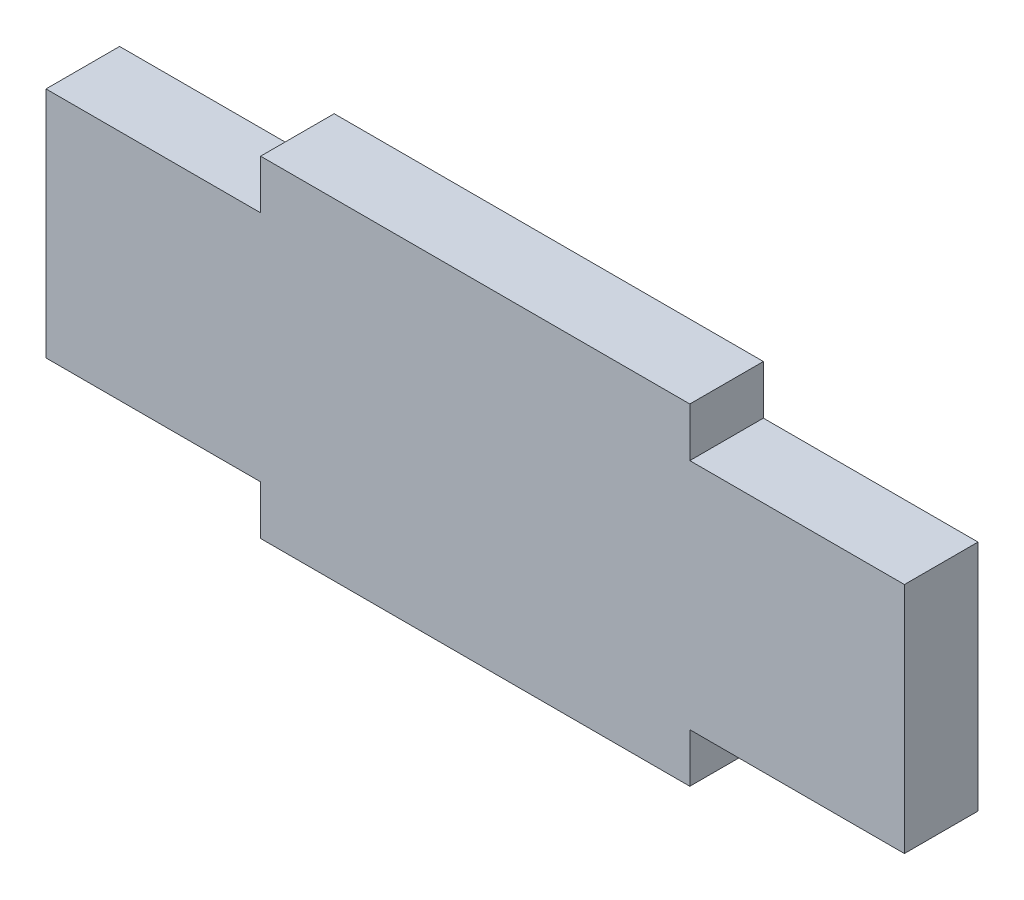
ISO-10303-21;
HEADER;
FILE_DESCRIPTION(('STEP AP214'),'2;1');
FILE_NAME('part.step','',(''),(''),'','','');
FILE_SCHEMA(('AUTOMOTIVE_DESIGN { 1 0 10303 214 1 1 1 1 }'));
ENDSEC;
DATA;
#1=APPLICATION_CONTEXT('core data for automotive mechanical design processes');
#2=APPLICATION_PROTOCOL_DEFINITION('international standard','automotive_design',2000,#1);
#3=PRODUCT_CONTEXT('',#1,'mechanical');
#4=PRODUCT('Part','Part','',(#3));
#5=PRODUCT_RELATED_PRODUCT_CATEGORY('part','',(#4));
#6=PRODUCT_DEFINITION_FORMATION('','',#4);
#7=PRODUCT_DEFINITION_CONTEXT('part definition',#1,'design');
#8=PRODUCT_DEFINITION('design','',#6,#7);
#9=PRODUCT_DEFINITION_SHAPE('','',#8);
#10=(LENGTH_UNIT() NAMED_UNIT(*) SI_UNIT(.MILLI.,.METRE.));
#11=(NAMED_UNIT(*) PLANE_ANGLE_UNIT() SI_UNIT($,.RADIAN.));
#12=(NAMED_UNIT(*) SI_UNIT($,.STERADIAN.) SOLID_ANGLE_UNIT());
#13=UNCERTAINTY_MEASURE_WITH_UNIT(LENGTH_MEASURE(1.E-05),#10,'distance_accuracy_value','');
#14=(GEOMETRIC_REPRESENTATION_CONTEXT(3) GLOBAL_UNCERTAINTY_ASSIGNED_CONTEXT((#13)) GLOBAL_UNIT_ASSIGNED_CONTEXT((#10,
#11,#12)) REPRESENTATION_CONTEXT('',''));
#15=CARTESIAN_POINT('',(0.,0.,0.));
#16=DIRECTION('',(0.,0.,1.));
#17=DIRECTION('',(1.,0.,0.));
#18=AXIS2_PLACEMENT_3D('',#15,#16,#17);
#19=CARTESIAN_POINT('',(0.,-9.5,6.));
#20=DIRECTION('',(0.,1.,0.));
#21=DIRECTION('',(-1.,0.,0.));
#22=AXIS2_PLACEMENT_3D('',#19,#20,#21);
#23=PLANE('',#22);
#24=DIRECTION('',(1.,0.,0.));
#25=VECTOR('',#24,1.);
#26=CARTESIAN_POINT('',(0.,-9.5,0.));
#27=LINE('',#26,#25);
#28=CARTESIAN_POINT('',(-35.,-9.5,0.));
#29=VERTEX_POINT('',#28);
#30=CARTESIAN_POINT('',(-17.5,-9.5,0.));
#31=VERTEX_POINT('',#30);
#32=EDGE_CURVE('E211',#29,#31,#27,.T.);
#33=ORIENTED_EDGE('',*,*,#32,.T.);
#34=DIRECTION('',(0.,0.,-1.));
#35=VECTOR('',#34,1.);
#36=CARTESIAN_POINT('',(-17.5,-9.5,6.));
#37=LINE('',#36,#35);
#38=CARTESIAN_POINT('',(-17.5,-9.5,6.));
#39=VERTEX_POINT('',#38);
#40=EDGE_CURVE('E11',#39,#31,#37,.T.);
#41=ORIENTED_EDGE('',*,*,#40,.F.);
#42=DIRECTION('',(1.,0.,0.));
#43=VECTOR('',#42,1.);
#44=CARTESIAN_POINT('',(0.,-9.5,6.));
#45=LINE('',#44,#43);
#46=CARTESIAN_POINT('',(-35.,-9.5,6.));
#47=VERTEX_POINT('',#46);
#48=EDGE_CURVE('E101',#47,#39,#45,.T.);
#49=ORIENTED_EDGE('',*,*,#48,.F.);
#50=DIRECTION('',(0.,0.,-1.));
#51=VECTOR('',#50,1.);
#52=CARTESIAN_POINT('',(-35.,-9.5,6.));
#53=LINE('',#52,#51);
#54=EDGE_CURVE('E52',#47,#29,#53,.T.);
#55=ORIENTED_EDGE('',*,*,#54,.T.);
#56=EDGE_LOOP('',(#33,#41,#49,#55));
#57=FACE_BOUND('',#56,.T.);
#58=ADVANCED_FACE('F35',(#57),#23,.F.);
#59=CARTESIAN_POINT('',(-17.5,0.,6.));
#60=DIRECTION('',(-1.,0.,0.));
#61=DIRECTION('',(0.,0.,1.));
#62=AXIS2_PLACEMENT_3D('',#59,#60,#61);
#63=PLANE('',#62);
#64=DIRECTION('',(0.,1.,0.));
#65=VECTOR('',#64,1.);
#66=CARTESIAN_POINT('',(-17.5,0.,0.));
#67=LINE('',#66,#65);
#68=CARTESIAN_POINT('',(-17.5,-13.5,0.));
#69=VERTEX_POINT('',#68);
#70=EDGE_CURVE('E210',#69,#31,#67,.T.);
#71=ORIENTED_EDGE('',*,*,#70,.F.);
#72=DIRECTION('',(0.,0.,-1.));
#73=VECTOR('',#72,1.);
#74=CARTESIAN_POINT('',(-17.5,-13.5,6.));
#75=LINE('',#74,#73);
#76=CARTESIAN_POINT('',(-17.5,-13.5,6.));
#77=VERTEX_POINT('',#76);
#78=EDGE_CURVE('E44',#77,#69,#75,.T.);
#79=ORIENTED_EDGE('',*,*,#78,.F.);
#80=DIRECTION('',(0.,1.,0.));
#81=VECTOR('',#80,1.);
#82=CARTESIAN_POINT('',(-17.5,0.,6.));
#83=LINE('',#82,#81);
#84=EDGE_CURVE('E173',#77,#39,#83,.T.);
#85=ORIENTED_EDGE('',*,*,#84,.T.);
#86=ORIENTED_EDGE('',*,*,#40,.T.);
#87=EDGE_LOOP('',(#71,#79,#85,#86));
#88=FACE_BOUND('',#87,.T.);
#89=ADVANCED_FACE('F37',(#88),#63,.T.);
#90=CARTESIAN_POINT('',(0.,-13.5,6.));
#91=DIRECTION('',(0.,-1.,0.));
#92=DIRECTION('',(1.,0.,0.));
#93=AXIS2_PLACEMENT_3D('',#90,#91,#92);
#94=PLANE('',#93);
#95=DIRECTION('',(-1.,0.,0.));
#96=VECTOR('',#95,1.);
#97=CARTESIAN_POINT('',(0.,-13.5,0.));
#98=LINE('',#97,#96);
#99=CARTESIAN_POINT('',(17.5,-13.5,0.));
#100=VERTEX_POINT('',#99);
#101=EDGE_CURVE('E206',#100,#69,#98,.T.);
#102=ORIENTED_EDGE('',*,*,#101,.F.);
#103=DIRECTION('',(0.,0.,-1.));
#104=VECTOR('',#103,1.);
#105=CARTESIAN_POINT('',(17.5,-13.5,6.));
#106=LINE('',#105,#104);
#107=CARTESIAN_POINT('',(17.5,-13.5,6.));
#108=VERTEX_POINT('',#107);
#109=EDGE_CURVE('E200',#108,#100,#106,.T.);
#110=ORIENTED_EDGE('',*,*,#109,.F.);
#111=DIRECTION('',(-1.,0.,0.));
#112=VECTOR('',#111,1.);
#113=CARTESIAN_POINT('',(0.,-13.5,6.));
#114=LINE('',#113,#112);
#115=EDGE_CURVE('E170',#108,#77,#114,.T.);
#116=ORIENTED_EDGE('',*,*,#115,.T.);
#117=ORIENTED_EDGE('',*,*,#78,.T.);
#118=EDGE_LOOP('',(#102,#110,#116,#117));
#119=FACE_BOUND('',#118,.T.);
#120=ADVANCED_FACE('F204',(#119),#94,.T.);
#121=CARTESIAN_POINT('',(17.5,0.,6.));
#122=DIRECTION('',(-1.,0.,0.));
#123=DIRECTION('',(0.,0.,1.));
#124=AXIS2_PLACEMENT_3D('',#121,#122,#123);
#125=PLANE('',#124);
#126=DIRECTION('',(0.,1.,0.));
#127=VECTOR('',#126,1.);
#128=CARTESIAN_POINT('',(17.5,0.,0.));
#129=LINE('',#128,#127);
#130=CARTESIAN_POINT('',(17.5,-9.5,0.));
#131=VERTEX_POINT('',#130);
#132=EDGE_CURVE('E216',#100,#131,#129,.T.);
#133=ORIENTED_EDGE('',*,*,#132,.T.);
#134=DIRECTION('',(0.,0.,-1.));
#135=VECTOR('',#134,1.);
#136=CARTESIAN_POINT('',(17.5,-9.5,6.));
#137=LINE('',#136,#135);
#138=CARTESIAN_POINT('',(17.5,-9.5,6.));
#139=VERTEX_POINT('',#138);
#140=EDGE_CURVE('E197',#139,#131,#137,.T.);
#141=ORIENTED_EDGE('',*,*,#140,.F.);
#142=DIRECTION('',(0.,1.,0.));
#143=VECTOR('',#142,1.);
#144=CARTESIAN_POINT('',(17.5,0.,6.));
#145=LINE('',#144,#143);
#146=EDGE_CURVE('E166',#108,#139,#145,.T.);
#147=ORIENTED_EDGE('',*,*,#146,.F.);
#148=ORIENTED_EDGE('',*,*,#109,.T.);
#149=EDGE_LOOP('',(#133,#141,#147,#148));
#150=FACE_BOUND('',#149,.T.);
#151=ADVANCED_FACE('F263',(#150),#125,.F.);
#152=CARTESIAN_POINT('',(35.,-9.5,0.));
#153=VERTEX_POINT('',#152);
#154=EDGE_CURVE('E218',#131,#153,#27,.T.);
#155=ORIENTED_EDGE('',*,*,#154,.T.);
#156=DIRECTION('',(0.,0.,-1.));
#157=VECTOR('',#156,1.);
#158=CARTESIAN_POINT('',(35.,-9.5,6.));
#159=LINE('',#158,#157);
#160=CARTESIAN_POINT('',(35.,-9.5,6.));
#161=VERTEX_POINT('',#160);
#162=EDGE_CURVE('E194',#161,#153,#159,.T.);
#163=ORIENTED_EDGE('',*,*,#162,.F.);
#164=EDGE_CURVE('E163',#139,#161,#45,.T.);
#165=ORIENTED_EDGE('',*,*,#164,.F.);
#166=ORIENTED_EDGE('',*,*,#140,.T.);
#167=EDGE_LOOP('',(#155,#163,#165,#166));
#168=FACE_BOUND('',#167,.T.);
#169=ADVANCED_FACE('F243',(#168),#23,.F.);
#170=CARTESIAN_POINT('',(35.,0.,6.));
#171=DIRECTION('',(-1.,0.,0.));
#172=DIRECTION('',(0.,0.,1.));
#173=AXIS2_PLACEMENT_3D('',#170,#171,#172);
#174=PLANE('',#173);
#175=DIRECTION('',(0.,1.,0.));
#176=VECTOR('',#175,1.);
#177=CARTESIAN_POINT('',(35.,0.,0.));
#178=LINE('',#177,#176);
#179=CARTESIAN_POINT('',(35.,9.5,0.));
#180=VERTEX_POINT('',#179);
#181=EDGE_CURVE('E222',#153,#180,#178,.T.);
#182=ORIENTED_EDGE('',*,*,#181,.T.);
#183=DIRECTION('',(0.,0.,-1.));
#184=VECTOR('',#183,1.);
#185=CARTESIAN_POINT('',(35.,9.5,6.));
#186=LINE('',#185,#184);
#187=CARTESIAN_POINT('',(35.,9.5,6.));
#188=VERTEX_POINT('',#187);
#189=EDGE_CURVE('E192',#188,#180,#186,.T.);
#190=ORIENTED_EDGE('',*,*,#189,.F.);
#191=DIRECTION('',(0.,1.,0.));
#192=VECTOR('',#191,1.);
#193=CARTESIAN_POINT('',(35.,0.,6.));
#194=LINE('',#193,#192);
#195=EDGE_CURVE('E159',#161,#188,#194,.T.);
#196=ORIENTED_EDGE('',*,*,#195,.F.);
#197=ORIENTED_EDGE('',*,*,#162,.T.);
#198=EDGE_LOOP('',(#182,#190,#196,#197));
#199=FACE_BOUND('',#198,.T.);
#200=ADVANCED_FACE('F239',(#199),#174,.F.);
#201=CARTESIAN_POINT('',(0.,9.5,6.));
#202=DIRECTION('',(0.,1.,0.));
#203=DIRECTION('',(-1.,0.,0.));
#204=AXIS2_PLACEMENT_3D('',#201,#202,#203);
#205=PLANE('',#204);
#206=DIRECTION('',(1.,0.,0.));
#207=VECTOR('',#206,1.);
#208=CARTESIAN_POINT('',(0.,9.5,0.));
#209=LINE('',#208,#207);
#210=CARTESIAN_POINT('',(17.5,9.5,0.));
#211=VERTEX_POINT('',#210);
#212=EDGE_CURVE('E181',#211,#180,#209,.T.);
#213=ORIENTED_EDGE('',*,*,#212,.F.);
#214=DIRECTION('',(0.,0.,-1.));
#215=VECTOR('',#214,1.);
#216=CARTESIAN_POINT('',(17.5,9.5,6.));
#217=LINE('',#216,#215);
#218=CARTESIAN_POINT('',(17.5,9.5,6.));
#219=VERTEX_POINT('',#218);
#220=EDGE_CURVE('E190',#219,#211,#217,.T.);
#221=ORIENTED_EDGE('',*,*,#220,.F.);
#222=DIRECTION('',(1.,0.,0.));
#223=VECTOR('',#222,1.);
#224=CARTESIAN_POINT('',(0.,9.5,6.));
#225=LINE('',#224,#223);
#226=EDGE_CURVE('E153',#219,#188,#225,.T.);
#227=ORIENTED_EDGE('',*,*,#226,.T.);
#228=ORIENTED_EDGE('',*,*,#189,.T.);
#229=EDGE_LOOP('',(#213,#221,#227,#228));
#230=FACE_BOUND('',#229,.T.);
#231=ADVANCED_FACE('F236',(#230),#205,.T.);
#232=CARTESIAN_POINT('',(17.5,0.,6.));
#233=DIRECTION('',(1.,0.,0.));
#234=DIRECTION('',(0.,0.,-1.));
#235=AXIS2_PLACEMENT_3D('',#232,#233,#234);
#236=PLANE('',#235);
#237=DIRECTION('',(0.,-1.,0.));
#238=VECTOR('',#237,1.);
#239=CARTESIAN_POINT('',(17.5,0.,0.));
#240=LINE('',#239,#238);
#241=CARTESIAN_POINT('',(17.5,13.5,0.));
#242=VERTEX_POINT('',#241);
#243=EDGE_CURVE('E226',#242,#211,#240,.T.);
#244=ORIENTED_EDGE('',*,*,#243,.F.);
#245=DIRECTION('',(0.,0.,-1.));
#246=VECTOR('',#245,1.);
#247=CARTESIAN_POINT('',(17.5,13.5,6.));
#248=LINE('',#247,#246);
#249=CARTESIAN_POINT('',(17.5,13.5,6.));
#250=VERTEX_POINT('',#249);
#251=EDGE_CURVE('E188',#250,#242,#248,.T.);
#252=ORIENTED_EDGE('',*,*,#251,.F.);
#253=DIRECTION('',(0.,-1.,0.));
#254=VECTOR('',#253,1.);
#255=CARTESIAN_POINT('',(17.5,0.,6.));
#256=LINE('',#255,#254);
#257=EDGE_CURVE('E158',#250,#219,#256,.T.);
#258=ORIENTED_EDGE('',*,*,#257,.T.);
#259=ORIENTED_EDGE('',*,*,#220,.T.);
#260=EDGE_LOOP('',(#244,#252,#258,#259));
#261=FACE_BOUND('',#260,.T.);
#262=ADVANCED_FACE('F234',(#261),#236,.T.);
#263=CARTESIAN_POINT('',(0.,13.5,6.));
#264=DIRECTION('',(0.,-1.,0.));
#265=DIRECTION('',(1.,0.,0.));
#266=AXIS2_PLACEMENT_3D('',#263,#264,#265);
#267=PLANE('',#266);
#268=DIRECTION('',(-1.,0.,0.));
#269=VECTOR('',#268,1.);
#270=CARTESIAN_POINT('',(0.,13.5,0.));
#271=LINE('',#270,#269);
#272=CARTESIAN_POINT('',(-17.5,13.5,0.));
#273=VERTEX_POINT('',#272);
#274=EDGE_CURVE('E228',#242,#273,#271,.T.);
#275=ORIENTED_EDGE('',*,*,#274,.T.);
#276=DIRECTION('',(0.,0.,-1.));
#277=VECTOR('',#276,1.);
#278=CARTESIAN_POINT('',(-17.5,13.5,6.));
#279=LINE('',#278,#277);
#280=CARTESIAN_POINT('',(-17.5,13.5,6.));
#281=VERTEX_POINT('',#280);
#282=EDGE_CURVE('E148',#281,#273,#279,.T.);
#283=ORIENTED_EDGE('',*,*,#282,.F.);
#284=DIRECTION('',(-1.,0.,0.));
#285=VECTOR('',#284,1.);
#286=CARTESIAN_POINT('',(0.,13.5,6.));
#287=LINE('',#286,#285);
#288=EDGE_CURVE('E136',#250,#281,#287,.T.);
#289=ORIENTED_EDGE('',*,*,#288,.F.);
#290=ORIENTED_EDGE('',*,*,#251,.T.);
#291=EDGE_LOOP('',(#275,#283,#289,#290));
#292=FACE_BOUND('',#291,.T.);
#293=ADVANCED_FACE('F231',(#292),#267,.F.);
#294=CARTESIAN_POINT('',(-17.5,0.,6.));
#295=DIRECTION('',(1.,0.,0.));
#296=DIRECTION('',(0.,0.,-1.));
#297=AXIS2_PLACEMENT_3D('',#294,#295,#296);
#298=PLANE('',#297);
#299=DIRECTION('',(0.,-1.,0.));
#300=VECTOR('',#299,1.);
#301=CARTESIAN_POINT('',(-17.5,0.,0.));
#302=LINE('',#301,#300);
#303=CARTESIAN_POINT('',(-17.5,9.5,0.));
#304=VERTEX_POINT('',#303);
#305=EDGE_CURVE('E145',#273,#304,#302,.T.);
#306=ORIENTED_EDGE('',*,*,#305,.T.);
#307=DIRECTION('',(0.,0.,-1.));
#308=VECTOR('',#307,1.);
#309=CARTESIAN_POINT('',(-17.5,9.5,6.));
#310=LINE('',#309,#308);
#311=CARTESIAN_POINT('',(-17.5,9.5,6.));
#312=VERTEX_POINT('',#311);
#313=EDGE_CURVE('E142',#312,#304,#310,.T.);
#314=ORIENTED_EDGE('',*,*,#313,.F.);
#315=DIRECTION('',(0.,-1.,0.));
#316=VECTOR('',#315,1.);
#317=CARTESIAN_POINT('',(-17.5,0.,6.));
#318=LINE('',#317,#316);
#319=EDGE_CURVE('E129',#281,#312,#318,.T.);
#320=ORIENTED_EDGE('',*,*,#319,.F.);
#321=ORIENTED_EDGE('',*,*,#282,.T.);
#322=EDGE_LOOP('',(#306,#314,#320,#321));
#323=FACE_BOUND('',#322,.T.);
#324=ADVANCED_FACE('F143',(#323),#298,.F.);
#325=CARTESIAN_POINT('',(-35.,9.5,0.));
#326=VERTEX_POINT('',#325);
#327=EDGE_CURVE('E177',#326,#304,#209,.T.);
#328=ORIENTED_EDGE('',*,*,#327,.F.);
#329=DIRECTION('',(0.,0.,-1.));
#330=VECTOR('',#329,1.);
#331=CARTESIAN_POINT('',(-35.,9.5,6.));
#332=LINE('',#331,#330);
#333=CARTESIAN_POINT('',(-35.,9.5,6.));
#334=VERTEX_POINT('',#333);
#335=EDGE_CURVE('E89',#334,#326,#332,.T.);
#336=ORIENTED_EDGE('',*,*,#335,.F.);
#337=EDGE_CURVE('E133',#334,#312,#225,.T.);
#338=ORIENTED_EDGE('',*,*,#337,.T.);
#339=ORIENTED_EDGE('',*,*,#313,.T.);
#340=EDGE_LOOP('',(#328,#336,#338,#339));
#341=FACE_BOUND('',#340,.T.);
#342=ADVANCED_FACE('F150',(#341),#205,.T.);
#343=CARTESIAN_POINT('',(-35.,0.,6.));
#344=DIRECTION('',(-1.,0.,0.));
#345=DIRECTION('',(0.,0.,1.));
#346=AXIS2_PLACEMENT_3D('',#343,#344,#345);
#347=PLANE('',#346);
#348=DIRECTION('',(0.,1.,0.));
#349=VECTOR('',#348,1.);
#350=CARTESIAN_POINT('',(-35.,0.,0.));
#351=LINE('',#350,#349);
#352=EDGE_CURVE('E175',#29,#326,#351,.T.);
#353=ORIENTED_EDGE('',*,*,#352,.F.);
#354=ORIENTED_EDGE('',*,*,#54,.F.);
#355=DIRECTION('',(0.,1.,0.));
#356=VECTOR('',#355,1.);
#357=CARTESIAN_POINT('',(-35.,0.,6.));
#358=LINE('',#357,#356);
#359=EDGE_CURVE('E151',#47,#334,#358,.T.);
#360=ORIENTED_EDGE('',*,*,#359,.T.);
#361=ORIENTED_EDGE('',*,*,#335,.T.);
#362=EDGE_LOOP('',(#353,#354,#360,#361));
#363=FACE_BOUND('',#362,.T.);
#364=ADVANCED_FACE('F245',(#363),#347,.T.);
#365=CARTESIAN_POINT('',(0.,0.,6.));
#366=DIRECTION('',(0.,0.,1.));
#367=DIRECTION('',(1.,0.,0.));
#368=AXIS2_PLACEMENT_3D('',#365,#366,#367);
#369=PLANE('',#368);
#370=ORIENTED_EDGE('',*,*,#48,.T.);
#371=ORIENTED_EDGE('',*,*,#84,.F.);
#372=ORIENTED_EDGE('',*,*,#115,.F.);
#373=ORIENTED_EDGE('',*,*,#146,.T.);
#374=ORIENTED_EDGE('',*,*,#164,.T.);
#375=ORIENTED_EDGE('',*,*,#195,.T.);
#376=ORIENTED_EDGE('',*,*,#226,.F.);
#377=ORIENTED_EDGE('',*,*,#257,.F.);
#378=ORIENTED_EDGE('',*,*,#288,.T.);
#379=ORIENTED_EDGE('',*,*,#319,.T.);
#380=ORIENTED_EDGE('',*,*,#337,.F.);
#381=ORIENTED_EDGE('',*,*,#359,.F.);
#382=EDGE_LOOP('',(#370,#371,#372,#373,#374,#375,#376,#377,#378,#379,#380,#381));
#383=FACE_BOUND('',#382,.T.);
#384=ADVANCED_FACE('F131',(#383),#369,.T.);
#385=CARTESIAN_POINT('',(0.,0.,0.));
#386=DIRECTION('',(0.,0.,1.));
#387=DIRECTION('',(1.,0.,0.));
#388=AXIS2_PLACEMENT_3D('',#385,#386,#387);
#389=PLANE('',#388);
#390=ORIENTED_EDGE('',*,*,#32,.F.);
#391=ORIENTED_EDGE('',*,*,#352,.T.);
#392=ORIENTED_EDGE('',*,*,#327,.T.);
#393=ORIENTED_EDGE('',*,*,#305,.F.);
#394=ORIENTED_EDGE('',*,*,#274,.F.);
#395=ORIENTED_EDGE('',*,*,#243,.T.);
#396=ORIENTED_EDGE('',*,*,#212,.T.);
#397=ORIENTED_EDGE('',*,*,#181,.F.);
#398=ORIENTED_EDGE('',*,*,#154,.F.);
#399=ORIENTED_EDGE('',*,*,#132,.F.);
#400=ORIENTED_EDGE('',*,*,#101,.T.);
#401=ORIENTED_EDGE('',*,*,#70,.T.);
#402=EDGE_LOOP('',(#390,#391,#392,#393,#394,#395,#396,#397,#398,#399,#400,#401));
#403=FACE_BOUND('',#402,.T.);
#404=ADVANCED_FACE('F214',(#403),#389,.F.);
#405=CLOSED_SHELL('',(#58,#89,#120,#151,#169,#200,#231,#262,#293,#324,#342,#364,#384,#404));
#406=MANIFOLD_SOLID_BREP('B2',#405);
#407=ADVANCED_BREP_SHAPE_REPRESENTATION('',(#18,#406),#14);
#408=SHAPE_DEFINITION_REPRESENTATION(#9,#407);
ENDSEC;
END-ISO-10303-21;
